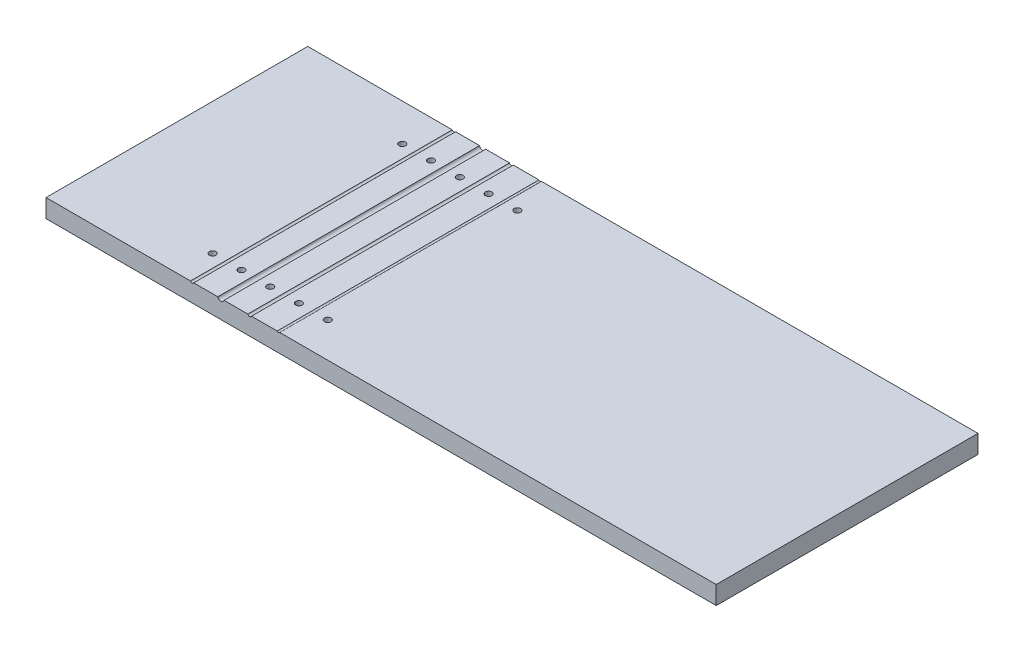
ISO-10303-21;
HEADER;
FILE_DESCRIPTION(('STEP AP214'),'2;1');
FILE_NAME('part.step','',(''),(''),'','','');
FILE_SCHEMA(('AUTOMOTIVE_DESIGN { 1 0 10303 214 1 1 1 1 }'));
ENDSEC;
DATA;
#1=APPLICATION_CONTEXT('core data for automotive mechanical design processes');
#2=APPLICATION_PROTOCOL_DEFINITION('international standard','automotive_design',2000,#1);
#3=PRODUCT_CONTEXT('',#1,'mechanical');
#4=PRODUCT('Part','Part','',(#3));
#5=PRODUCT_RELATED_PRODUCT_CATEGORY('part','',(#4));
#6=PRODUCT_DEFINITION_FORMATION('','',#4);
#7=PRODUCT_DEFINITION_CONTEXT('part definition',#1,'design');
#8=PRODUCT_DEFINITION('design','',#6,#7);
#9=PRODUCT_DEFINITION_SHAPE('','',#8);
#10=(LENGTH_UNIT() NAMED_UNIT(*) SI_UNIT(.MILLI.,.METRE.));
#11=(NAMED_UNIT(*) PLANE_ANGLE_UNIT() SI_UNIT($,.RADIAN.));
#12=(NAMED_UNIT(*) SI_UNIT($,.STERADIAN.) SOLID_ANGLE_UNIT());
#13=UNCERTAINTY_MEASURE_WITH_UNIT(LENGTH_MEASURE(1.E-05),#10,'distance_accuracy_value','');
#14=(GEOMETRIC_REPRESENTATION_CONTEXT(3) GLOBAL_UNCERTAINTY_ASSIGNED_CONTEXT((#13)) GLOBAL_UNIT_ASSIGNED_CONTEXT((#10,
#11,#12)) REPRESENTATION_CONTEXT('',''));
#15=CARTESIAN_POINT('',(0.,0.,0.));
#16=DIRECTION('',(0.,0.,1.));
#17=DIRECTION('',(1.,0.,0.));
#18=AXIS2_PLACEMENT_3D('',#15,#16,#17);
#19=CARTESIAN_POINT('',(0.,6.35,0.));
#20=DIRECTION('',(0.,1.,0.));
#21=DIRECTION('',(0.,0.,1.));
#22=AXIS2_PLACEMENT_3D('',#19,#20,#21);
#23=PLANE('',#22);
#24=CARTESIAN_POINT('',(69.420618556701,6.35,-72.4912460309142));
#25=DIRECTION('',(0.,1.,0.));
#26=DIRECTION('',(0.,0.,1.));
#27=AXIS2_PLACEMENT_3D('',#24,#25,#26);
#28=CIRCLE('',#27,1.1303);
#29=CARTESIAN_POINT('',(69.420618556701,6.35,-71.3609460309142));
#30=VERTEX_POINT('',#29);
#31=EDGE_CURVE('E302',#30,#30,#28,.T.);
#32=ORIENTED_EDGE('',*,*,#31,.F.);
#33=EDGE_LOOP('',(#32));
#34=FACE_BOUND('',#33,.T.);
#35=CARTESIAN_POINT('',(69.420618556701,6.35,-6.57431660018482));
#36=DIRECTION('',(0.,1.,0.));
#37=DIRECTION('',(0.,0.,1.));
#38=AXIS2_PLACEMENT_3D('',#35,#36,#37);
#39=CIRCLE('',#38,1.1303);
#40=CARTESIAN_POINT('',(69.420618556701,6.35,-5.44401660018481));
#41=VERTEX_POINT('',#40);
#42=EDGE_CURVE('E314',#41,#41,#39,.T.);
#43=ORIENTED_EDGE('',*,*,#42,.F.);
#44=EDGE_LOOP('',(#43));
#45=FACE_BOUND('',#44,.T.);
#46=DIRECTION('',(0.,0.,1.));
#47=VECTOR('',#46,1.);
#48=CARTESIAN_POINT('',(73.9876058548088,6.35,-85.433676975945));
#49=LINE('',#48,#47);
#50=CARTESIAN_POINT('',(73.9876058548088,6.35,-85.433676975945));
#51=VERTEX_POINT('',#50);
#52=CARTESIAN_POINT('',(73.9876058548088,6.35,5.56632302405498));
#53=VERTEX_POINT('',#52);
#54=EDGE_CURVE('E11',#51,#53,#49,.T.);
#55=ORIENTED_EDGE('',*,*,#54,.F.);
#56=DIRECTION('',(-1.,0.,0.));
#57=VECTOR('',#56,1.);
#58=CARTESIAN_POINT('',(-6.37938144329898,6.35,-85.433676975945));
#59=LINE('',#58,#57);
#60=CARTESIAN_POINT('',(65.0592277016402,6.35,-85.433676975945));
#61=VERTEX_POINT('',#60);
#62=EDGE_CURVE('E154',#51,#61,#59,.T.);
#63=ORIENTED_EDGE('',*,*,#62,.T.);
#64=DIRECTION('',(0.,0.,1.));
#65=VECTOR('',#64,1.);
#66=CARTESIAN_POINT('',(65.0592277016402,6.35,-85.433676975945));
#67=LINE('',#66,#65);
#68=CARTESIAN_POINT('',(65.0592277016402,6.35,5.56632302405498));
#69=VERTEX_POINT('',#68);
#70=EDGE_CURVE('E136',#69,#61,#67,.F.);
#71=ORIENTED_EDGE('',*,*,#70,.F.);
#72=DIRECTION('',(1.,0.,0.));
#73=VECTOR('',#72,1.);
#74=CARTESIAN_POINT('',(-6.37938144329897,6.35,5.56632302405498));
#75=LINE('',#74,#73);
#76=EDGE_CURVE('E131',#69,#53,#75,.T.);
#77=ORIENTED_EDGE('',*,*,#76,.T.);
#78=EDGE_LOOP('',(#55,#63,#71,#77));
#79=FACE_BOUND('',#78,.T.);
#80=ADVANCED_FACE('F34',(#34,#45,#79),#23,.T.);
#81=CARTESIAN_POINT('',(59.420618556701,6.35,-72.4912460309142));
#82=DIRECTION('',(0.,1.,0.));
#83=DIRECTION('',(0.,0.,1.));
#84=AXIS2_PLACEMENT_3D('',#81,#82,#83);
#85=CIRCLE('',#84,1.1303);
#86=CARTESIAN_POINT('',(59.420618556701,6.35,-71.3609460309142));
#87=VERTEX_POINT('',#86);
#88=EDGE_CURVE('E532',#87,#87,#85,.T.);
#89=ORIENTED_EDGE('',*,*,#88,.F.);
#90=EDGE_LOOP('',(#89));
#91=FACE_BOUND('',#90,.T.);
#92=CARTESIAN_POINT('',(59.420618556701,6.35,-6.57431660018482));
#93=DIRECTION('',(0.,1.,0.));
#94=DIRECTION('',(0.,0.,1.));
#95=AXIS2_PLACEMENT_3D('',#92,#93,#94);
#96=CIRCLE('',#95,1.1303);
#97=CARTESIAN_POINT('',(59.420618556701,6.35,-5.44401660018482));
#98=VERTEX_POINT('',#97);
#99=EDGE_CURVE('E290',#98,#98,#96,.T.);
#100=ORIENTED_EDGE('',*,*,#99,.F.);
#101=EDGE_LOOP('',(#100));
#102=FACE_BOUND('',#101,.T.);
#103=DIRECTION('',(0.,0.,1.));
#104=VECTOR('',#103,1.);
#105=CARTESIAN_POINT('',(63.7820094117618,6.35,-85.433676975945));
#106=LINE('',#105,#104);
#107=CARTESIAN_POINT('',(63.7820094117618,6.35,-85.433676975945));
#108=VERTEX_POINT('',#107);
#109=CARTESIAN_POINT('',(63.7820094117618,6.35,5.56632302405498));
#110=VERTEX_POINT('',#109);
#111=EDGE_CURVE('E187',#108,#110,#106,.T.);
#112=ORIENTED_EDGE('',*,*,#111,.F.);
#113=CARTESIAN_POINT('',(55.4918328209825,6.35,-85.433676975945));
#114=VERTEX_POINT('',#113);
#115=EDGE_CURVE('E215',#108,#114,#59,.T.);
#116=ORIENTED_EDGE('',*,*,#115,.T.);
#117=DIRECTION('',(0.,0.,1.));
#118=VECTOR('',#117,1.);
#119=CARTESIAN_POINT('',(55.4918328209825,6.35,-85.433676975945));
#120=LINE('',#119,#118);
#121=CARTESIAN_POINT('',(55.4918328209825,6.35,5.56632302405498));
#122=VERTEX_POINT('',#121);
#123=EDGE_CURVE('E181',#122,#114,#120,.F.);
#124=ORIENTED_EDGE('',*,*,#123,.F.);
#125=EDGE_CURVE('E137',#122,#110,#75,.T.);
#126=ORIENTED_EDGE('',*,*,#125,.T.);
#127=EDGE_LOOP('',(#112,#116,#124,#126));
#128=FACE_BOUND('',#127,.T.);
#129=ADVANCED_FACE('F244',(#91,#102,#128),#23,.T.);
#130=CARTESIAN_POINT('',(49.420618556701,6.35,-72.4912460309142));
#131=DIRECTION('',(0.,1.,0.));
#132=DIRECTION('',(0.,0.,1.));
#133=AXIS2_PLACEMENT_3D('',#130,#131,#132);
#134=CIRCLE('',#133,1.1303);
#135=CARTESIAN_POINT('',(49.420618556701,6.35,-71.3609460309142));
#136=VERTEX_POINT('',#135);
#137=EDGE_CURVE('E540',#136,#136,#134,.T.);
#138=ORIENTED_EDGE('',*,*,#137,.F.);
#139=EDGE_LOOP('',(#138));
#140=FACE_BOUND('',#139,.T.);
#141=CARTESIAN_POINT('',(49.420618556701,6.35,-6.57431660018482));
#142=DIRECTION('',(0.,1.,0.));
#143=DIRECTION('',(0.,0.,1.));
#144=AXIS2_PLACEMENT_3D('',#141,#142,#143);
#145=CIRCLE('',#144,1.1303);
#146=CARTESIAN_POINT('',(49.420618556701,6.35,-5.44401660018481));
#147=VERTEX_POINT('',#146);
#148=EDGE_CURVE('E293',#147,#147,#145,.T.);
#149=ORIENTED_EDGE('',*,*,#148,.F.);
#150=EDGE_LOOP('',(#149));
#151=FACE_BOUND('',#150,.T.);
#152=DIRECTION('',(0.,0.,1.));
#153=VECTOR('',#152,1.);
#154=CARTESIAN_POINT('',(53.3494042924196,6.35,-85.433676975945));
#155=LINE('',#154,#153);
#156=CARTESIAN_POINT('',(53.3494042924196,6.35,-85.433676975945));
#157=VERTEX_POINT('',#156);
#158=CARTESIAN_POINT('',(53.3494042924196,6.35,5.56632302405498));
#159=VERTEX_POINT('',#158);
#160=EDGE_CURVE('E184',#157,#159,#155,.T.);
#161=ORIENTED_EDGE('',*,*,#160,.F.);
#162=CARTESIAN_POINT('',(44.9904933587409,6.35,-85.433676975945));
#163=VERTEX_POINT('',#162);
#164=EDGE_CURVE('E214',#157,#163,#59,.T.);
#165=ORIENTED_EDGE('',*,*,#164,.T.);
#166=DIRECTION('',(0.,0.,1.));
#167=VECTOR('',#166,1.);
#168=CARTESIAN_POINT('',(44.9904933587409,6.35,-85.433676975945));
#169=LINE('',#168,#167);
#170=CARTESIAN_POINT('',(44.9904933587409,6.35,5.56632302405498));
#171=VERTEX_POINT('',#170);
#172=EDGE_CURVE('E176',#171,#163,#169,.F.);
#173=ORIENTED_EDGE('',*,*,#172,.F.);
#174=EDGE_CURVE('E140',#171,#159,#75,.T.);
#175=ORIENTED_EDGE('',*,*,#174,.T.);
#176=EDGE_LOOP('',(#161,#165,#173,#175));
#177=FACE_BOUND('',#176,.T.);
#178=ADVANCED_FACE('F239',(#140,#151,#177),#23,.T.);
#179=CARTESIAN_POINT('',(39.420618556701,6.35,-72.4912460309142));
#180=DIRECTION('',(0.,1.,0.));
#181=DIRECTION('',(0.,0.,1.));
#182=AXIS2_PLACEMENT_3D('',#179,#180,#181);
#183=CIRCLE('',#182,1.1303);
#184=CARTESIAN_POINT('',(39.420618556701,6.35,-71.3609460309142));
#185=VERTEX_POINT('',#184);
#186=EDGE_CURVE('E281',#185,#185,#183,.T.);
#187=ORIENTED_EDGE('',*,*,#186,.F.);
#188=EDGE_LOOP('',(#187));
#189=FACE_BOUND('',#188,.T.);
#190=CARTESIAN_POINT('',(39.420618556701,6.35,-6.57431660018482));
#191=DIRECTION('',(0.,1.,0.));
#192=DIRECTION('',(0.,0.,1.));
#193=AXIS2_PLACEMENT_3D('',#190,#191,#192);
#194=CIRCLE('',#193,1.1303);
#195=CARTESIAN_POINT('',(39.420618556701,6.35,-5.44401660018481));
#196=VERTEX_POINT('',#195);
#197=EDGE_CURVE('E284',#196,#196,#194,.T.);
#198=ORIENTED_EDGE('',*,*,#197,.F.);
#199=EDGE_LOOP('',(#198));
#200=FACE_BOUND('',#199,.T.);
#201=DIRECTION('',(0.,0.,1.));
#202=VECTOR('',#201,1.);
#203=CARTESIAN_POINT('',(43.8507437546611,6.35,-85.433676975945));
#204=LINE('',#203,#202);
#205=CARTESIAN_POINT('',(43.8507437546611,6.35,-85.433676975945));
#206=VERTEX_POINT('',#205);
#207=CARTESIAN_POINT('',(43.8507437546611,6.35,5.56632302405498));
#208=VERTEX_POINT('',#207);
#209=EDGE_CURVE('E179',#206,#208,#204,.T.);
#210=ORIENTED_EDGE('',*,*,#209,.F.);
#211=CARTESIAN_POINT('',(-6.37938144329898,6.35,-85.433676975945));
#212=VERTEX_POINT('',#211);
#213=EDGE_CURVE('E149',#206,#212,#59,.T.);
#214=ORIENTED_EDGE('',*,*,#213,.T.);
#215=DIRECTION('',(0.,0.,1.));
#216=VECTOR('',#215,1.);
#217=CARTESIAN_POINT('',(-6.37938144329898,6.35,-85.433676975945));
#218=LINE('',#217,#216);
#219=CARTESIAN_POINT('',(-6.37938144329897,6.35,5.56632302405498));
#220=VERTEX_POINT('',#219);
#221=EDGE_CURVE('E141',#212,#220,#218,.T.);
#222=ORIENTED_EDGE('',*,*,#221,.T.);
#223=EDGE_CURVE('E142',#220,#208,#75,.T.);
#224=ORIENTED_EDGE('',*,*,#223,.T.);
#225=EDGE_LOOP('',(#210,#214,#222,#224));
#226=FACE_BOUND('',#225,.T.);
#227=ADVANCED_FACE('F252',(#189,#200,#226),#23,.T.);
#228=CARTESIAN_POINT('',(-6.37938144329898,6.35,-85.433676975945));
#229=DIRECTION('',(1.,0.,0.));
#230=DIRECTION('',(0.,0.,-1.));
#231=AXIS2_PLACEMENT_3D('',#228,#229,#230);
#232=PLANE('',#231);
#233=DIRECTION('',(0.,0.,1.));
#234=VECTOR('',#233,1.);
#235=CARTESIAN_POINT('',(-6.37938144329898,0.,-85.433676975945));
#236=LINE('',#235,#234);
#237=CARTESIAN_POINT('',(-6.37938144329898,0.,-85.433676975945));
#238=VERTEX_POINT('',#237);
#239=CARTESIAN_POINT('',(-6.37938144329897,0.,5.56632302405498));
#240=VERTEX_POINT('',#239);
#241=EDGE_CURVE('E155',#238,#240,#236,.T.);
#242=ORIENTED_EDGE('',*,*,#241,.T.);
#243=DIRECTION('',(0.,-1.,0.));
#244=VECTOR('',#243,1.);
#245=CARTESIAN_POINT('',(-6.37938144329897,6.35,5.56632302405498));
#246=LINE('',#245,#244);
#247=EDGE_CURVE('E173',#220,#240,#246,.T.);
#248=ORIENTED_EDGE('',*,*,#247,.F.);
#249=ORIENTED_EDGE('',*,*,#221,.F.);
#250=DIRECTION('',(0.,-1.,0.));
#251=VECTOR('',#250,1.);
#252=CARTESIAN_POINT('',(-6.37938144329898,6.35,-85.433676975945));
#253=LINE('',#252,#251);
#254=EDGE_CURVE('E153',#212,#238,#253,.T.);
#255=ORIENTED_EDGE('',*,*,#254,.T.);
#256=EDGE_LOOP('',(#242,#248,#249,#255));
#257=FACE_BOUND('',#256,.T.);
#258=ADVANCED_FACE('F36',(#257),#232,.F.);
#259=CARTESIAN_POINT('',(-6.37938144329897,6.35,5.56632302405498));
#260=DIRECTION('',(0.,0.,-1.));
#261=DIRECTION('',(-1.,0.,0.));
#262=AXIS2_PLACEMENT_3D('',#259,#260,#261);
#263=PLANE('',#262);
#264=CARTESIAN_POINT('',(74.8536312585933,6.35,5.56632302405498));
#265=VERTEX_POINT('',#264);
#266=CARTESIAN_POINT('',(226.620618556701,6.35,5.56632302405498));
#267=VERTEX_POINT('',#266);
#268=EDGE_CURVE('E133',#265,#267,#75,.T.);
#269=ORIENTED_EDGE('',*,*,#268,.F.);
#270=CARTESIAN_POINT('',(74.420618556701,6.6,5.56632302405498));
#271=DIRECTION('',(0.,0.,1.));
#272=DIRECTION('',(1.,0.,0.));
#273=AXIS2_PLACEMENT_3D('',#270,#271,#272);
#274=CIRCLE('',#273,0.499999999999999);
#275=EDGE_CURVE('E48',#53,#265,#274,.T.);
#276=ORIENTED_EDGE('',*,*,#275,.F.);
#277=ORIENTED_EDGE('',*,*,#76,.F.);
#278=CARTESIAN_POINT('',(64.420618556701,6.6,5.56632302405498));
#279=DIRECTION('',(0.,0.,1.));
#280=DIRECTION('',(1.,0.,0.));
#281=AXIS2_PLACEMENT_3D('',#278,#279,#280);
#282=CIRCLE('',#281,0.685799999999995);
#283=EDGE_CURVE('E56',#110,#69,#282,.T.);
#284=ORIENTED_EDGE('',*,*,#283,.F.);
#285=ORIENTED_EDGE('',*,*,#125,.F.);
#286=CARTESIAN_POINT('',(54.420618556701,6.6,5.56632302405498));
#287=DIRECTION('',(0.,0.,1.));
#288=DIRECTION('',(1.,0.,0.));
#289=AXIS2_PLACEMENT_3D('',#286,#287,#288);
#290=CIRCLE('',#289,1.1);
#291=EDGE_CURVE('E226',#159,#122,#290,.T.);
#292=ORIENTED_EDGE('',*,*,#291,.F.);
#293=ORIENTED_EDGE('',*,*,#174,.F.);
#294=CARTESIAN_POINT('',(44.420618556701,6.6,5.56632302405498));
#295=DIRECTION('',(0.,0.,1.));
#296=DIRECTION('',(1.,0.,0.));
#297=AXIS2_PLACEMENT_3D('',#294,#295,#296);
#298=CIRCLE('',#297,0.622300000000001);
#299=EDGE_CURVE('E232',#208,#171,#298,.T.);
#300=ORIENTED_EDGE('',*,*,#299,.F.);
#301=ORIENTED_EDGE('',*,*,#223,.F.);
#302=ORIENTED_EDGE('',*,*,#247,.T.);
#303=DIRECTION('',(1.,0.,0.));
#304=VECTOR('',#303,1.);
#305=CARTESIAN_POINT('',(-6.37938144329897,0.,5.56632302405498));
#306=LINE('',#305,#304);
#307=CARTESIAN_POINT('',(226.620618556701,0.,5.56632302405498));
#308=VERTEX_POINT('',#307);
#309=EDGE_CURVE('E158',#240,#308,#306,.T.);
#310=ORIENTED_EDGE('',*,*,#309,.T.);
#311=DIRECTION('',(0.,-1.,0.));
#312=VECTOR('',#311,1.);
#313=CARTESIAN_POINT('',(226.620618556701,6.35,5.56632302405498));
#314=LINE('',#313,#312);
#315=EDGE_CURVE('E170',#267,#308,#314,.T.);
#316=ORIENTED_EDGE('',*,*,#315,.F.);
#317=EDGE_LOOP('',(#269,#276,#277,#284,#285,#292,#293,#300,#301,#302,#310,#316));
#318=FACE_BOUND('',#317,.T.);
#319=ADVANCED_FACE('F130',(#318),#263,.F.);
#320=CARTESIAN_POINT('',(226.620618556701,6.35,-85.433676975945));
#321=DIRECTION('',(-1.,0.,0.));
#322=DIRECTION('',(0.,0.,1.));
#323=AXIS2_PLACEMENT_3D('',#320,#321,#322);
#324=PLANE('',#323);
#325=DIRECTION('',(0.,0.,-1.));
#326=VECTOR('',#325,1.);
#327=CARTESIAN_POINT('',(226.620618556701,0.,-85.433676975945));
#328=LINE('',#327,#326);
#329=CARTESIAN_POINT('',(226.620618556701,0.,-85.433676975945));
#330=VERTEX_POINT('',#329);
#331=EDGE_CURVE('E161',#308,#330,#328,.T.);
#332=ORIENTED_EDGE('',*,*,#331,.T.);
#333=DIRECTION('',(0.,-1.,0.));
#334=VECTOR('',#333,1.);
#335=CARTESIAN_POINT('',(226.620618556701,6.35,-85.433676975945));
#336=LINE('',#335,#334);
#337=CARTESIAN_POINT('',(226.620618556701,6.35,-85.433676975945));
#338=VERTEX_POINT('',#337);
#339=EDGE_CURVE('E167',#338,#330,#336,.T.);
#340=ORIENTED_EDGE('',*,*,#339,.F.);
#341=DIRECTION('',(0.,0.,-1.));
#342=VECTOR('',#341,1.);
#343=CARTESIAN_POINT('',(226.620618556701,6.35,-85.433676975945));
#344=LINE('',#343,#342);
#345=EDGE_CURVE('E146',#267,#338,#344,.T.);
#346=ORIENTED_EDGE('',*,*,#345,.F.);
#347=ORIENTED_EDGE('',*,*,#315,.T.);
#348=EDGE_LOOP('',(#332,#340,#346,#347));
#349=FACE_BOUND('',#348,.T.);
#350=ADVANCED_FACE('F198',(#349),#324,.F.);
#351=CARTESIAN_POINT('',(-6.37938144329898,6.35,-85.433676975945));
#352=DIRECTION('',(0.,0.,1.));
#353=DIRECTION('',(1.,0.,0.));
#354=AXIS2_PLACEMENT_3D('',#351,#352,#353);
#355=PLANE('',#354);
#356=ORIENTED_EDGE('',*,*,#62,.F.);
#357=CARTESIAN_POINT('',(74.420618556701,6.6,-85.433676975945));
#358=DIRECTION('',(0.,0.,1.));
#359=DIRECTION('',(1.,0.,0.));
#360=AXIS2_PLACEMENT_3D('',#357,#358,#359);
#361=CIRCLE('',#360,0.499999999999999);
#362=CARTESIAN_POINT('',(74.8536312585933,6.35,-85.433676975945));
#363=VERTEX_POINT('',#362);
#364=EDGE_CURVE('E123',#51,#363,#361,.T.);
#365=ORIENTED_EDGE('',*,*,#364,.T.);
#366=EDGE_CURVE('E150',#338,#363,#59,.T.);
#367=ORIENTED_EDGE('',*,*,#366,.F.);
#368=ORIENTED_EDGE('',*,*,#339,.T.);
#369=DIRECTION('',(-1.,0.,0.));
#370=VECTOR('',#369,1.);
#371=CARTESIAN_POINT('',(-6.37938144329898,0.,-85.433676975945));
#372=LINE('',#371,#370);
#373=EDGE_CURVE('E163',#330,#238,#372,.T.);
#374=ORIENTED_EDGE('',*,*,#373,.T.);
#375=ORIENTED_EDGE('',*,*,#254,.F.);
#376=ORIENTED_EDGE('',*,*,#213,.F.);
#377=CARTESIAN_POINT('',(44.420618556701,6.6,-85.433676975945));
#378=DIRECTION('',(0.,0.,1.));
#379=DIRECTION('',(1.,0.,0.));
#380=AXIS2_PLACEMENT_3D('',#377,#378,#379);
#381=CIRCLE('',#380,0.622300000000001);
#382=EDGE_CURVE('E159',#206,#163,#381,.T.);
#383=ORIENTED_EDGE('',*,*,#382,.T.);
#384=ORIENTED_EDGE('',*,*,#164,.F.);
#385=CARTESIAN_POINT('',(54.420618556701,6.6,-85.433676975945));
#386=DIRECTION('',(0.,0.,1.));
#387=DIRECTION('',(1.,0.,0.));
#388=AXIS2_PLACEMENT_3D('',#385,#386,#387);
#389=CIRCLE('',#388,1.1);
#390=EDGE_CURVE('E228',#157,#114,#389,.T.);
#391=ORIENTED_EDGE('',*,*,#390,.T.);
#392=ORIENTED_EDGE('',*,*,#115,.F.);
#393=CARTESIAN_POINT('',(64.420618556701,6.6,-85.433676975945));
#394=DIRECTION('',(0.,0.,1.));
#395=DIRECTION('',(1.,0.,0.));
#396=AXIS2_PLACEMENT_3D('',#393,#394,#395);
#397=CIRCLE('',#396,0.685799999999995);
#398=EDGE_CURVE('E224',#108,#61,#397,.T.);
#399=ORIENTED_EDGE('',*,*,#398,.T.);
#400=EDGE_LOOP('',(#356,#365,#367,#368,#374,#375,#376,#383,#384,#391,#392,#399));
#401=FACE_BOUND('',#400,.T.);
#402=ADVANCED_FACE('F191',(#401),#355,.F.);
#403=CARTESIAN_POINT('',(79.420618556701,6.35,-72.4912460309142));
#404=DIRECTION('',(0.,1.,0.));
#405=DIRECTION('',(0.,0.,1.));
#406=AXIS2_PLACEMENT_3D('',#403,#404,#405);
#407=CIRCLE('',#406,1.1303);
#408=CARTESIAN_POINT('',(79.420618556701,6.35,-71.3609460309142));
#409=VERTEX_POINT('',#408);
#410=EDGE_CURVE('E308',#409,#409,#407,.T.);
#411=ORIENTED_EDGE('',*,*,#410,.F.);
#412=EDGE_LOOP('',(#411));
#413=FACE_BOUND('',#412,.T.);
#414=CARTESIAN_POINT('',(79.420618556701,6.35,-6.57431660018482));
#415=DIRECTION('',(0.,1.,0.));
#416=DIRECTION('',(0.,0.,1.));
#417=AXIS2_PLACEMENT_3D('',#414,#415,#416);
#418=CIRCLE('',#417,1.1303);
#419=CARTESIAN_POINT('',(79.420618556701,6.35,-5.44401660018481));
#420=VERTEX_POINT('',#419);
#421=EDGE_CURVE('E320',#420,#420,#418,.T.);
#422=ORIENTED_EDGE('',*,*,#421,.F.);
#423=EDGE_LOOP('',(#422));
#424=FACE_BOUND('',#423,.T.);
#425=DIRECTION('',(0.,0.,1.));
#426=VECTOR('',#425,1.);
#427=CARTESIAN_POINT('',(74.8536312585933,6.35,-85.433676975945));
#428=LINE('',#427,#426);
#429=EDGE_CURVE('E42',#265,#363,#428,.F.);
#430=ORIENTED_EDGE('',*,*,#429,.F.);
#431=ORIENTED_EDGE('',*,*,#268,.T.);
#432=ORIENTED_EDGE('',*,*,#345,.T.);
#433=ORIENTED_EDGE('',*,*,#366,.T.);
#434=EDGE_LOOP('',(#430,#431,#432,#433));
#435=FACE_BOUND('',#434,.T.);
#436=ADVANCED_FACE('F194',(#413,#424,#435),#23,.T.);
#437=CARTESIAN_POINT('',(0.,0.,0.));
#438=DIRECTION('',(0.,1.,0.));
#439=DIRECTION('',(0.,0.,1.));
#440=AXIS2_PLACEMENT_3D('',#437,#438,#439);
#441=PLANE('',#440);
#442=CARTESIAN_POINT('',(39.420618556701,0.,-72.4912460309142));
#443=DIRECTION('',(0.,1.,0.));
#444=DIRECTION('',(0.,0.,1.));
#445=AXIS2_PLACEMENT_3D('',#442,#443,#444);
#446=CIRCLE('',#445,1.1303);
#447=CARTESIAN_POINT('',(39.420618556701,0.,-71.3609460309142));
#448=VERTEX_POINT('',#447);
#449=EDGE_CURVE('E530',#448,#448,#446,.T.);
#450=ORIENTED_EDGE('',*,*,#449,.T.);
#451=EDGE_LOOP('',(#450));
#452=FACE_BOUND('',#451,.T.);
#453=CARTESIAN_POINT('',(59.420618556701,0.,-72.4912460309142));
#454=DIRECTION('',(0.,1.,0.));
#455=DIRECTION('',(0.,0.,1.));
#456=AXIS2_PLACEMENT_3D('',#453,#454,#455);
#457=CIRCLE('',#456,1.1303);
#458=CARTESIAN_POINT('',(59.420618556701,0.,-71.3609460309142));
#459=VERTEX_POINT('',#458);
#460=EDGE_CURVE('E537',#459,#459,#457,.T.);
#461=ORIENTED_EDGE('',*,*,#460,.T.);
#462=EDGE_LOOP('',(#461));
#463=FACE_BOUND('',#462,.T.);
#464=CARTESIAN_POINT('',(49.420618556701,0.,-72.4912460309142));
#465=DIRECTION('',(0.,1.,0.));
#466=DIRECTION('',(0.,0.,1.));
#467=AXIS2_PLACEMENT_3D('',#464,#465,#466);
#468=CIRCLE('',#467,1.1303);
#469=CARTESIAN_POINT('',(49.420618556701,0.,-71.3609460309142));
#470=VERTEX_POINT('',#469);
#471=EDGE_CURVE('E543',#470,#470,#468,.T.);
#472=ORIENTED_EDGE('',*,*,#471,.T.);
#473=EDGE_LOOP('',(#472));
#474=FACE_BOUND('',#473,.T.);
#475=CARTESIAN_POINT('',(49.420618556701,0.,-6.57431660018482));
#476=DIRECTION('',(0.,1.,0.));
#477=DIRECTION('',(0.,0.,1.));
#478=AXIS2_PLACEMENT_3D('',#475,#476,#477);
#479=CIRCLE('',#478,1.1303);
#480=CARTESIAN_POINT('',(49.420618556701,0.,-5.44401660018481));
#481=VERTEX_POINT('',#480);
#482=EDGE_CURVE('E287',#481,#481,#479,.T.);
#483=ORIENTED_EDGE('',*,*,#482,.T.);
#484=EDGE_LOOP('',(#483));
#485=FACE_BOUND('',#484,.T.);
#486=CARTESIAN_POINT('',(39.420618556701,0.,-6.57431660018482));
#487=DIRECTION('',(0.,1.,0.));
#488=DIRECTION('',(0.,0.,1.));
#489=AXIS2_PLACEMENT_3D('',#486,#487,#488);
#490=CIRCLE('',#489,1.1303);
#491=CARTESIAN_POINT('',(39.420618556701,0.,-5.44401660018481));
#492=VERTEX_POINT('',#491);
#493=EDGE_CURVE('E286',#492,#492,#490,.T.);
#494=ORIENTED_EDGE('',*,*,#493,.T.);
#495=EDGE_LOOP('',(#494));
#496=FACE_BOUND('',#495,.T.);
#497=CARTESIAN_POINT('',(59.420618556701,0.,-6.57431660018482));
#498=DIRECTION('',(0.,1.,0.));
#499=DIRECTION('',(0.,0.,1.));
#500=AXIS2_PLACEMENT_3D('',#497,#498,#499);
#501=CIRCLE('',#500,1.1303);
#502=CARTESIAN_POINT('',(59.420618556701,0.,-5.44401660018482));
#503=VERTEX_POINT('',#502);
#504=EDGE_CURVE('E299',#503,#503,#501,.T.);
#505=ORIENTED_EDGE('',*,*,#504,.T.);
#506=EDGE_LOOP('',(#505));
#507=FACE_BOUND('',#506,.T.);
#508=CARTESIAN_POINT('',(69.420618556701,0.,-72.4912460309142));
#509=DIRECTION('',(0.,1.,0.));
#510=DIRECTION('',(0.,0.,1.));
#511=AXIS2_PLACEMENT_3D('',#508,#509,#510);
#512=CIRCLE('',#511,1.1303);
#513=CARTESIAN_POINT('',(69.420618556701,0.,-71.3609460309142));
#514=VERTEX_POINT('',#513);
#515=EDGE_CURVE('E305',#514,#514,#512,.T.);
#516=ORIENTED_EDGE('',*,*,#515,.T.);
#517=EDGE_LOOP('',(#516));
#518=FACE_BOUND('',#517,.T.);
#519=CARTESIAN_POINT('',(79.420618556701,0.,-72.4912460309142));
#520=DIRECTION('',(0.,1.,0.));
#521=DIRECTION('',(0.,0.,1.));
#522=AXIS2_PLACEMENT_3D('',#519,#520,#521);
#523=CIRCLE('',#522,1.1303);
#524=CARTESIAN_POINT('',(79.420618556701,0.,-71.3609460309142));
#525=VERTEX_POINT('',#524);
#526=EDGE_CURVE('E311',#525,#525,#523,.T.);
#527=ORIENTED_EDGE('',*,*,#526,.T.);
#528=EDGE_LOOP('',(#527));
#529=FACE_BOUND('',#528,.T.);
#530=CARTESIAN_POINT('',(69.420618556701,0.,-6.57431660018482));
#531=DIRECTION('',(0.,1.,0.));
#532=DIRECTION('',(0.,0.,1.));
#533=AXIS2_PLACEMENT_3D('',#530,#531,#532);
#534=CIRCLE('',#533,1.1303);
#535=CARTESIAN_POINT('',(69.420618556701,0.,-5.44401660018481));
#536=VERTEX_POINT('',#535);
#537=EDGE_CURVE('E317',#536,#536,#534,.T.);
#538=ORIENTED_EDGE('',*,*,#537,.T.);
#539=EDGE_LOOP('',(#538));
#540=FACE_BOUND('',#539,.T.);
#541=CARTESIAN_POINT('',(79.420618556701,0.,-6.57431660018482));
#542=DIRECTION('',(0.,1.,0.));
#543=DIRECTION('',(0.,0.,1.));
#544=AXIS2_PLACEMENT_3D('',#541,#542,#543);
#545=CIRCLE('',#544,1.1303);
#546=CARTESIAN_POINT('',(79.420618556701,0.,-5.44401660018481));
#547=VERTEX_POINT('',#546);
#548=EDGE_CURVE('E134',#547,#547,#545,.T.);
#549=ORIENTED_EDGE('',*,*,#548,.T.);
#550=EDGE_LOOP('',(#549));
#551=FACE_BOUND('',#550,.T.);
#552=ORIENTED_EDGE('',*,*,#241,.F.);
#553=ORIENTED_EDGE('',*,*,#373,.F.);
#554=ORIENTED_EDGE('',*,*,#331,.F.);
#555=ORIENTED_EDGE('',*,*,#309,.F.);
#556=EDGE_LOOP('',(#552,#553,#554,#555));
#557=FACE_BOUND('',#556,.T.);
#558=ADVANCED_FACE('F204',(#452,#463,#474,#485,#496,#507,#518,#529,#540,#551,#557),#441,.F.);
#559=CARTESIAN_POINT('',(44.420618556701,6.6,-85.433676975945));
#560=DIRECTION('',(0.,0.,1.));
#561=DIRECTION('',(1.,0.,0.));
#562=AXIS2_PLACEMENT_3D('',#559,#560,#561);
#563=CYLINDRICAL_SURFACE('',#562,0.622300000000001);
#564=ORIENTED_EDGE('',*,*,#209,.T.);
#565=ORIENTED_EDGE('',*,*,#299,.T.);
#566=ORIENTED_EDGE('',*,*,#172,.T.);
#567=ORIENTED_EDGE('',*,*,#382,.F.);
#568=EDGE_LOOP('',(#564,#565,#566,#567));
#569=FACE_BOUND('',#568,.T.);
#570=ADVANCED_FACE('F236',(#569),#563,.F.);
#571=CARTESIAN_POINT('',(54.420618556701,6.6,-85.433676975945));
#572=DIRECTION('',(0.,0.,1.));
#573=DIRECTION('',(1.,0.,0.));
#574=AXIS2_PLACEMENT_3D('',#571,#572,#573);
#575=CYLINDRICAL_SURFACE('',#574,1.1);
#576=ORIENTED_EDGE('',*,*,#160,.T.);
#577=ORIENTED_EDGE('',*,*,#291,.T.);
#578=ORIENTED_EDGE('',*,*,#123,.T.);
#579=ORIENTED_EDGE('',*,*,#390,.F.);
#580=EDGE_LOOP('',(#576,#577,#578,#579));
#581=FACE_BOUND('',#580,.T.);
#582=ADVANCED_FACE('F243',(#581),#575,.F.);
#583=CARTESIAN_POINT('',(64.420618556701,6.6,-85.433676975945));
#584=DIRECTION('',(0.,0.,1.));
#585=DIRECTION('',(1.,0.,0.));
#586=AXIS2_PLACEMENT_3D('',#583,#584,#585);
#587=CYLINDRICAL_SURFACE('',#586,0.685799999999995);
#588=ORIENTED_EDGE('',*,*,#111,.T.);
#589=ORIENTED_EDGE('',*,*,#283,.T.);
#590=ORIENTED_EDGE('',*,*,#70,.T.);
#591=ORIENTED_EDGE('',*,*,#398,.F.);
#592=EDGE_LOOP('',(#588,#589,#590,#591));
#593=FACE_BOUND('',#592,.T.);
#594=ADVANCED_FACE('F223',(#593),#587,.F.);
#595=CARTESIAN_POINT('',(74.420618556701,6.6,-85.433676975945));
#596=DIRECTION('',(0.,0.,1.));
#597=DIRECTION('',(1.,0.,0.));
#598=AXIS2_PLACEMENT_3D('',#595,#596,#597);
#599=CYLINDRICAL_SURFACE('',#598,0.499999999999999);
#600=ORIENTED_EDGE('',*,*,#54,.T.);
#601=ORIENTED_EDGE('',*,*,#275,.T.);
#602=ORIENTED_EDGE('',*,*,#429,.T.);
#603=ORIENTED_EDGE('',*,*,#364,.F.);
#604=EDGE_LOOP('',(#600,#601,#602,#603));
#605=FACE_BOUND('',#604,.T.);
#606=ADVANCED_FACE('F121',(#605),#599,.F.);
#607=CARTESIAN_POINT('',(79.420618556701,6.35,-6.57431660018482));
#608=DIRECTION('',(0.,1.,0.));
#609=DIRECTION('',(0.,0.,1.));
#610=AXIS2_PLACEMENT_3D('',#607,#608,#609);
#611=CYLINDRICAL_SURFACE('',#610,1.1303);
#612=ORIENTED_EDGE('',*,*,#548,.F.);
#613=EDGE_LOOP('',(#612));
#614=FACE_BOUND('',#613,.T.);
#615=ORIENTED_EDGE('',*,*,#421,.T.);
#616=EDGE_LOOP('',(#615));
#617=FACE_BOUND('',#616,.T.);
#618=ADVANCED_FACE('F327',(#614,#617),#611,.F.);
#619=CARTESIAN_POINT('',(69.420618556701,6.35,-6.57431660018482));
#620=DIRECTION('',(0.,1.,0.));
#621=DIRECTION('',(0.,0.,1.));
#622=AXIS2_PLACEMENT_3D('',#619,#620,#621);
#623=CYLINDRICAL_SURFACE('',#622,1.1303);
#624=ORIENTED_EDGE('',*,*,#537,.F.);
#625=EDGE_LOOP('',(#624));
#626=FACE_BOUND('',#625,.T.);
#627=ORIENTED_EDGE('',*,*,#42,.T.);
#628=EDGE_LOOP('',(#627));
#629=FACE_BOUND('',#628,.T.);
#630=ADVANCED_FACE('F330',(#626,#629),#623,.F.);
#631=CARTESIAN_POINT('',(79.420618556701,6.35,-72.4912460309142));
#632=DIRECTION('',(0.,1.,0.));
#633=DIRECTION('',(0.,0.,1.));
#634=AXIS2_PLACEMENT_3D('',#631,#632,#633);
#635=CYLINDRICAL_SURFACE('',#634,1.1303);
#636=ORIENTED_EDGE('',*,*,#526,.F.);
#637=EDGE_LOOP('',(#636));
#638=FACE_BOUND('',#637,.T.);
#639=ORIENTED_EDGE('',*,*,#410,.T.);
#640=EDGE_LOOP('',(#639));
#641=FACE_BOUND('',#640,.T.);
#642=ADVANCED_FACE('F338',(#638,#641),#635,.F.);
#643=CARTESIAN_POINT('',(69.420618556701,6.35,-72.4912460309142));
#644=DIRECTION('',(0.,1.,0.));
#645=DIRECTION('',(0.,0.,1.));
#646=AXIS2_PLACEMENT_3D('',#643,#644,#645);
#647=CYLINDRICAL_SURFACE('',#646,1.1303);
#648=ORIENTED_EDGE('',*,*,#515,.F.);
#649=EDGE_LOOP('',(#648));
#650=FACE_BOUND('',#649,.T.);
#651=ORIENTED_EDGE('',*,*,#31,.T.);
#652=EDGE_LOOP('',(#651));
#653=FACE_BOUND('',#652,.T.);
#654=ADVANCED_FACE('F436',(#650,#653),#647,.F.);
#655=CARTESIAN_POINT('',(59.420618556701,6.35,-6.57431660018482));
#656=DIRECTION('',(0.,1.,0.));
#657=DIRECTION('',(0.,0.,1.));
#658=AXIS2_PLACEMENT_3D('',#655,#656,#657);
#659=CYLINDRICAL_SURFACE('',#658,1.1303);
#660=ORIENTED_EDGE('',*,*,#504,.F.);
#661=EDGE_LOOP('',(#660));
#662=FACE_BOUND('',#661,.T.);
#663=ORIENTED_EDGE('',*,*,#99,.T.);
#664=EDGE_LOOP('',(#663));
#665=FACE_BOUND('',#664,.T.);
#666=ADVANCED_FACE('F445',(#662,#665),#659,.F.);
#667=CARTESIAN_POINT('',(39.420618556701,6.35,-6.57431660018482));
#668=DIRECTION('',(0.,1.,0.));
#669=DIRECTION('',(0.,0.,1.));
#670=AXIS2_PLACEMENT_3D('',#667,#668,#669);
#671=CYLINDRICAL_SURFACE('',#670,1.1303);
#672=ORIENTED_EDGE('',*,*,#493,.F.);
#673=EDGE_LOOP('',(#672));
#674=FACE_BOUND('',#673,.T.);
#675=ORIENTED_EDGE('',*,*,#197,.T.);
#676=EDGE_LOOP('',(#675));
#677=FACE_BOUND('',#676,.T.);
#678=ADVANCED_FACE('F455',(#674,#677),#671,.F.);
#679=CARTESIAN_POINT('',(49.420618556701,6.35,-6.57431660018482));
#680=DIRECTION('',(0.,1.,0.));
#681=DIRECTION('',(0.,0.,1.));
#682=AXIS2_PLACEMENT_3D('',#679,#680,#681);
#683=CYLINDRICAL_SURFACE('',#682,1.1303);
#684=ORIENTED_EDGE('',*,*,#482,.F.);
#685=EDGE_LOOP('',(#684));
#686=FACE_BOUND('',#685,.T.);
#687=ORIENTED_EDGE('',*,*,#148,.T.);
#688=EDGE_LOOP('',(#687));
#689=FACE_BOUND('',#688,.T.);
#690=ADVANCED_FACE('F465',(#686,#689),#683,.F.);
#691=CARTESIAN_POINT('',(49.420618556701,6.35,-72.4912460309142));
#692=DIRECTION('',(0.,1.,0.));
#693=DIRECTION('',(0.,0.,1.));
#694=AXIS2_PLACEMENT_3D('',#691,#692,#693);
#695=CYLINDRICAL_SURFACE('',#694,1.1303);
#696=ORIENTED_EDGE('',*,*,#471,.F.);
#697=EDGE_LOOP('',(#696));
#698=FACE_BOUND('',#697,.T.);
#699=ORIENTED_EDGE('',*,*,#137,.T.);
#700=EDGE_LOOP('',(#699));
#701=FACE_BOUND('',#700,.T.);
#702=ADVANCED_FACE('F475',(#698,#701),#695,.F.);
#703=CARTESIAN_POINT('',(59.420618556701,6.35,-72.4912460309142));
#704=DIRECTION('',(0.,1.,0.));
#705=DIRECTION('',(0.,0.,1.));
#706=AXIS2_PLACEMENT_3D('',#703,#704,#705);
#707=CYLINDRICAL_SURFACE('',#706,1.1303);
#708=ORIENTED_EDGE('',*,*,#460,.F.);
#709=EDGE_LOOP('',(#708));
#710=FACE_BOUND('',#709,.T.);
#711=ORIENTED_EDGE('',*,*,#88,.T.);
#712=EDGE_LOOP('',(#711));
#713=FACE_BOUND('',#712,.T.);
#714=ADVANCED_FACE('F485',(#710,#713),#707,.F.);
#715=CARTESIAN_POINT('',(39.420618556701,6.35,-72.4912460309142));
#716=DIRECTION('',(0.,1.,0.));
#717=DIRECTION('',(0.,0.,1.));
#718=AXIS2_PLACEMENT_3D('',#715,#716,#717);
#719=CYLINDRICAL_SURFACE('',#718,1.1303);
#720=ORIENTED_EDGE('',*,*,#449,.F.);
#721=EDGE_LOOP('',(#720));
#722=FACE_BOUND('',#721,.T.);
#723=ORIENTED_EDGE('',*,*,#186,.T.);
#724=EDGE_LOOP('',(#723));
#725=FACE_BOUND('',#724,.T.);
#726=ADVANCED_FACE('F495',(#722,#725),#719,.F.);
#727=CLOSED_SHELL('',(#80,#129,#178,#227,#258,#319,#350,#402,#436,#558,#570,#582,#594,#606,#618,
#630,#642,#654,#666,#678,#690,#702,#714,#726));
#728=MANIFOLD_SOLID_BREP('B2',#727);
#729=ADVANCED_BREP_SHAPE_REPRESENTATION('',(#18,#728),#14);
#730=SHAPE_DEFINITION_REPRESENTATION(#9,#729);
ENDSEC;
END-ISO-10303-21;
